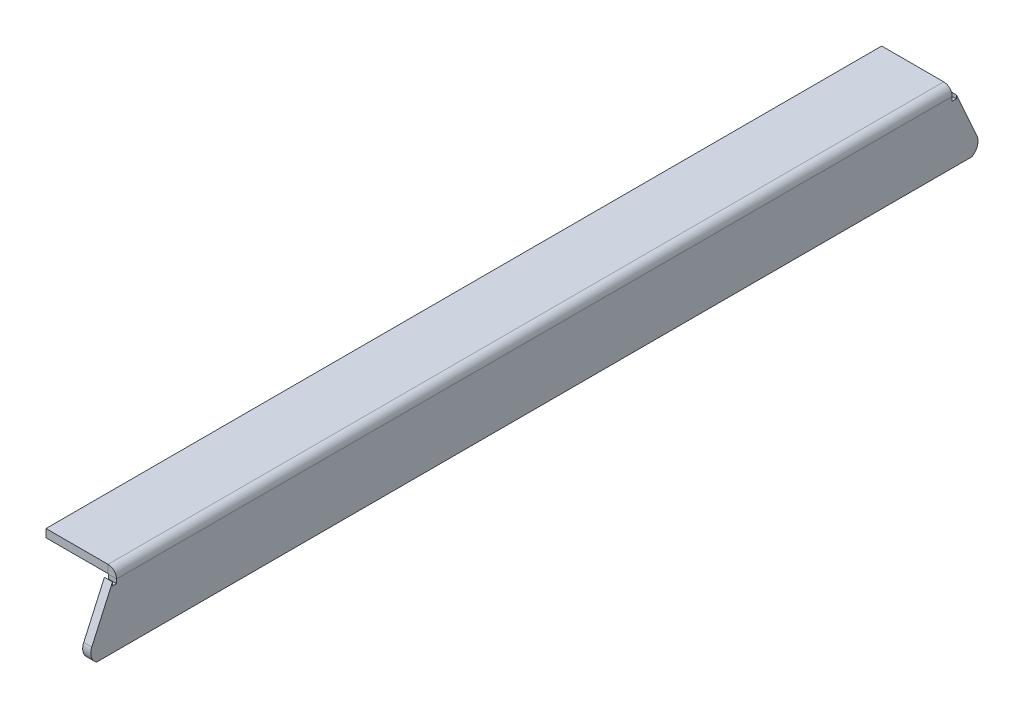
ISO-10303-21;
HEADER;
FILE_DESCRIPTION(('STEP AP214'),'2;1');
FILE_NAME('part.step','',(''),(''),'','','');
FILE_SCHEMA(('AUTOMOTIVE_DESIGN { 1 0 10303 214 1 1 1 1 }'));
ENDSEC;
DATA;
#1=APPLICATION_CONTEXT('core data for automotive mechanical design processes');
#2=APPLICATION_PROTOCOL_DEFINITION('international standard','automotive_design',2000,#1);
#3=PRODUCT_CONTEXT('',#1,'mechanical');
#4=PRODUCT('Part','Part','',(#3));
#5=PRODUCT_RELATED_PRODUCT_CATEGORY('part','',(#4));
#6=PRODUCT_DEFINITION_FORMATION('','',#4);
#7=PRODUCT_DEFINITION_CONTEXT('part definition',#1,'design');
#8=PRODUCT_DEFINITION('design','',#6,#7);
#9=PRODUCT_DEFINITION_SHAPE('','',#8);
#10=(LENGTH_UNIT() NAMED_UNIT(*) SI_UNIT(.MILLI.,.METRE.));
#11=(NAMED_UNIT(*) PLANE_ANGLE_UNIT() SI_UNIT($,.RADIAN.));
#12=(NAMED_UNIT(*) SI_UNIT($,.STERADIAN.) SOLID_ANGLE_UNIT());
#13=UNCERTAINTY_MEASURE_WITH_UNIT(LENGTH_MEASURE(1.E-05),#10,'distance_accuracy_value','');
#14=(GEOMETRIC_REPRESENTATION_CONTEXT(3) GLOBAL_UNCERTAINTY_ASSIGNED_CONTEXT((#13)) GLOBAL_UNIT_ASSIGNED_CONTEXT((#10,
#11,#12)) REPRESENTATION_CONTEXT('',''));
#15=CARTESIAN_POINT('',(0.,0.,0.));
#16=DIRECTION('',(0.,0.,1.));
#17=DIRECTION('',(1.,0.,0.));
#18=AXIS2_PLACEMENT_3D('',#15,#16,#17);
#19=CARTESIAN_POINT('',(-4.,20.5593429480245,-177.194547185028));
#20=DIRECTION('',(0.,0.,1.));
#21=DIRECTION('',(1.,0.,0.));
#22=AXIS2_PLACEMENT_3D('',#19,#20,#21);
#23=PLANE('',#22);
#24=DIRECTION('',(0.,-1.,0.));
#25=VECTOR('',#24,1.);
#26=CARTESIAN_POINT('',(0.,-4.76315361424819,-177.194547185028));
#27=LINE('',#26,#25);
#28=CARTESIAN_POINT('',(0.,20.5593429480245,-177.194547185028));
#29=VERTEX_POINT('',#28);
#30=CARTESIAN_POINT('',(0.,18.8106793541965,-177.194547185028));
#31=VERTEX_POINT('',#30);
#32=EDGE_CURVE('E13',#29,#31,#27,.T.);
#33=ORIENTED_EDGE('',*,*,#32,.F.);
#34=DIRECTION('',(1.,0.,0.));
#35=VECTOR('',#34,1.);
#36=CARTESIAN_POINT('',(-4.,20.5593429480245,-177.194547185028));
#37=LINE('',#36,#35);
#38=CARTESIAN_POINT('',(-4.,20.5593429480245,-177.194547185028));
#39=VERTEX_POINT('',#38);
#40=EDGE_CURVE('E251',#39,#29,#37,.T.);
#41=ORIENTED_EDGE('',*,*,#40,.F.);
#42=DIRECTION('',(0.,-1.,0.));
#43=VECTOR('',#42,1.);
#44=CARTESIAN_POINT('',(-4.,20.5593429480245,-177.194547185028));
#45=LINE('',#44,#43);
#46=CARTESIAN_POINT('',(-4.,18.8106793541965,-177.194547185028));
#47=VERTEX_POINT('',#46);
#48=EDGE_CURVE('E247',#39,#47,#45,.T.);
#49=ORIENTED_EDGE('',*,*,#48,.T.);
#50=DIRECTION('',(1.,0.,0.));
#51=VECTOR('',#50,1.);
#52=CARTESIAN_POINT('',(-4.,18.8106793541965,-177.194547185028));
#53=LINE('',#52,#51);
#54=EDGE_CURVE('E255',#47,#31,#53,.T.);
#55=ORIENTED_EDGE('',*,*,#54,.T.);
#56=EDGE_LOOP('',(#33,#41,#49,#55));
#57=FACE_BOUND('',#56,.T.);
#58=ADVANCED_FACE('F57',(#57),#23,.T.);
#59=CARTESIAN_POINT('',(-4.,18.8106793541965,-177.194547185028));
#60=DIRECTION('',(0.,1.,0.));
#61=DIRECTION('',(0.,0.,1.));
#62=AXIS2_PLACEMENT_3D('',#59,#60,#61);
#63=PLANE('',#62);
#64=DIRECTION('',(0.,0.,1.));
#65=VECTOR('',#64,1.);
#66=CARTESIAN_POINT('',(0.,18.8106793541965,246.371480001946));
#67=LINE('',#66,#65);
#68=CARTESIAN_POINT('',(0.,18.8106793541965,-175.194547185028));
#69=VERTEX_POINT('',#68);
#70=EDGE_CURVE('E65',#31,#69,#67,.T.);
#71=ORIENTED_EDGE('',*,*,#70,.F.);
#72=ORIENTED_EDGE('',*,*,#54,.F.);
#73=DIRECTION('',(0.,0.,1.));
#74=VECTOR('',#73,1.);
#75=CARTESIAN_POINT('',(-4.,18.8106793541965,-177.194547185028));
#76=LINE('',#75,#74);
#77=CARTESIAN_POINT('',(-4.,18.8106793541965,-175.194547185028));
#78=VERTEX_POINT('',#77);
#79=EDGE_CURVE('E252',#47,#78,#76,.T.);
#80=ORIENTED_EDGE('',*,*,#79,.T.);
#81=DIRECTION('',(1.,0.,0.));
#82=VECTOR('',#81,1.);
#83=CARTESIAN_POINT('',(-4.,18.8106793541965,-175.194547185028));
#84=LINE('',#83,#82);
#85=EDGE_CURVE('E259',#78,#69,#84,.T.);
#86=ORIENTED_EDGE('',*,*,#85,.T.);
#87=EDGE_LOOP('',(#71,#72,#80,#86));
#88=FACE_BOUND('',#87,.T.);
#89=ADVANCED_FACE('F325',(#88),#63,.T.);
#90=CARTESIAN_POINT('',(-4.,18.8106793541965,-175.194547185028));
#91=DIRECTION('',(0.,0.,-1.));
#92=DIRECTION('',(-1.,0.,0.));
#93=AXIS2_PLACEMENT_3D('',#90,#91,#92);
#94=PLANE('',#93);
#95=DIRECTION('',(0.,1.,0.));
#96=VECTOR('',#95,1.);
#97=CARTESIAN_POINT('',(0.,-4.76315361424819,-175.194547185028));
#98=LINE('',#97,#96);
#99=CARTESIAN_POINT('',(0.,20.8106793541965,-175.194547185028));
#100=VERTEX_POINT('',#99);
#101=EDGE_CURVE('E319',#69,#100,#98,.T.);
#102=ORIENTED_EDGE('',*,*,#101,.F.);
#103=ORIENTED_EDGE('',*,*,#85,.F.);
#104=DIRECTION('',(0.,1.,0.));
#105=VECTOR('',#104,1.);
#106=CARTESIAN_POINT('',(-4.,18.8106793541965,-175.194547185028));
#107=LINE('',#106,#105);
#108=CARTESIAN_POINT('',(-4.,20.8106793541965,-175.194547185028));
#109=VERTEX_POINT('',#108);
#110=EDGE_CURVE('E256',#78,#109,#107,.T.);
#111=ORIENTED_EDGE('',*,*,#110,.T.);
#112=DIRECTION('',(1.,0.,0.));
#113=VECTOR('',#112,1.);
#114=CARTESIAN_POINT('',(-4.,20.8106793541965,-175.194547185028));
#115=LINE('',#114,#113);
#116=EDGE_CURVE('E235',#109,#100,#115,.T.);
#117=ORIENTED_EDGE('',*,*,#116,.T.);
#118=EDGE_LOOP('',(#102,#103,#111,#117));
#119=FACE_BOUND('',#118,.T.);
#120=ADVANCED_FACE('F335',(#119),#94,.T.);
#121=CARTESIAN_POINT('',(-4.,20.8106793541965,239.571798792427));
#122=DIRECTION('',(0.,0.,1.));
#123=DIRECTION('',(1.,0.,0.));
#124=AXIS2_PLACEMENT_3D('',#121,#122,#123);
#125=PLANE('',#124);
#126=DIRECTION('',(0.,-1.,0.));
#127=VECTOR('',#126,1.);
#128=CARTESIAN_POINT('',(0.,-4.76315361424819,239.571798792427));
#129=LINE('',#128,#127);
#130=CARTESIAN_POINT('',(0.,20.8106793541965,239.571798792427));
#131=VERTEX_POINT('',#130);
#132=CARTESIAN_POINT('',(0.,18.8106793541965,239.571798792427));
#133=VERTEX_POINT('',#132);
#134=EDGE_CURVE('E316',#131,#133,#129,.T.);
#135=ORIENTED_EDGE('',*,*,#134,.F.);
#136=DIRECTION('',(1.,0.,0.));
#137=VECTOR('',#136,1.);
#138=CARTESIAN_POINT('',(-4.,20.8106793541965,239.571798792427));
#139=LINE('',#138,#137);
#140=CARTESIAN_POINT('',(-4.,20.8106793541965,239.571798792427));
#141=VERTEX_POINT('',#140);
#142=EDGE_CURVE('E242',#141,#131,#139,.T.);
#143=ORIENTED_EDGE('',*,*,#142,.F.);
#144=DIRECTION('',(0.,-1.,0.));
#145=VECTOR('',#144,1.);
#146=CARTESIAN_POINT('',(-4.,20.8106793541965,239.571798792427));
#147=LINE('',#146,#145);
#148=CARTESIAN_POINT('',(-4.,18.8106793541965,239.571798792427));
#149=VERTEX_POINT('',#148);
#150=EDGE_CURVE('E260',#141,#149,#147,.T.);
#151=ORIENTED_EDGE('',*,*,#150,.T.);
#152=DIRECTION('',(1.,0.,0.));
#153=VECTOR('',#152,1.);
#154=CARTESIAN_POINT('',(-4.,18.8106793541965,239.571798792427));
#155=LINE('',#154,#153);
#156=EDGE_CURVE('E266',#149,#133,#155,.T.);
#157=ORIENTED_EDGE('',*,*,#156,.T.);
#158=EDGE_LOOP('',(#135,#143,#151,#157));
#159=FACE_BOUND('',#158,.T.);
#160=ADVANCED_FACE('F399',(#159),#125,.T.);
#161=CARTESIAN_POINT('',(-4.,18.8106793541965,239.571798792427));
#162=DIRECTION('',(0.,1.,0.));
#163=DIRECTION('',(0.,0.,1.));
#164=AXIS2_PLACEMENT_3D('',#161,#162,#163);
#165=PLANE('',#164);
#166=DIRECTION('',(0.,0.,1.));
#167=VECTOR('',#166,1.);
#168=CARTESIAN_POINT('',(0.,18.8106793541965,246.371480001946));
#169=LINE('',#168,#167);
#170=CARTESIAN_POINT('',(0.,18.8106793541965,241.571798792427));
#171=VERTEX_POINT('',#170);
#172=EDGE_CURVE('E313',#133,#171,#169,.T.);
#173=ORIENTED_EDGE('',*,*,#172,.F.);
#174=ORIENTED_EDGE('',*,*,#156,.F.);
#175=DIRECTION('',(0.,0.,1.));
#176=VECTOR('',#175,1.);
#177=CARTESIAN_POINT('',(-4.,18.8106793541965,239.571798792427));
#178=LINE('',#177,#176);
#179=CARTESIAN_POINT('',(-4.,18.8106793541965,241.571798792427));
#180=VERTEX_POINT('',#179);
#181=EDGE_CURVE('E263',#149,#180,#178,.T.);
#182=ORIENTED_EDGE('',*,*,#181,.T.);
#183=DIRECTION('',(1.,0.,0.));
#184=VECTOR('',#183,1.);
#185=CARTESIAN_POINT('',(-4.,18.8106793541965,241.571798792427));
#186=LINE('',#185,#184);
#187=EDGE_CURVE('E245',#180,#171,#186,.T.);
#188=ORIENTED_EDGE('',*,*,#187,.T.);
#189=EDGE_LOOP('',(#173,#174,#182,#188));
#190=FACE_BOUND('',#189,.T.);
#191=ADVANCED_FACE('F389',(#190),#165,.T.);
#192=CARTESIAN_POINT('',(-4.,18.8106793541965,241.571798792427));
#193=DIRECTION('',(0.,0.,-1.));
#194=DIRECTION('',(-1.,0.,0.));
#195=AXIS2_PLACEMENT_3D('',#192,#193,#194);
#196=PLANE('',#195);
#197=DIRECTION('',(0.,1.,0.));
#198=VECTOR('',#197,1.);
#199=CARTESIAN_POINT('',(0.,-4.76315361424819,241.571798792427));
#200=LINE('',#199,#198);
#201=CARTESIAN_POINT('',(0.,20.5593429480245,241.571798792427));
#202=VERTEX_POINT('',#201);
#203=EDGE_CURVE('E306',#171,#202,#200,.T.);
#204=ORIENTED_EDGE('',*,*,#203,.F.);
#205=ORIENTED_EDGE('',*,*,#187,.F.);
#206=DIRECTION('',(0.,1.,0.));
#207=VECTOR('',#206,1.);
#208=CARTESIAN_POINT('',(-4.,18.8106793541965,241.571798792427));
#209=LINE('',#208,#207);
#210=CARTESIAN_POINT('',(-4.,20.5593429480245,241.571798792427));
#211=VERTEX_POINT('',#210);
#212=EDGE_CURVE('E267',#180,#211,#209,.T.);
#213=ORIENTED_EDGE('',*,*,#212,.T.);
#214=DIRECTION('',(1.,0.,0.));
#215=VECTOR('',#214,1.);
#216=CARTESIAN_POINT('',(-4.,20.5593429480245,241.571798792427));
#217=LINE('',#216,#215);
#218=EDGE_CURVE('E72',#211,#202,#217,.T.);
#219=ORIENTED_EDGE('',*,*,#218,.T.);
#220=EDGE_LOOP('',(#204,#205,#213,#219));
#221=FACE_BOUND('',#220,.T.);
#222=ADVANCED_FACE('F385',(#221),#196,.T.);
#223=CARTESIAN_POINT('',(-4.,-2.3041370040118,-187.46718347481));
#224=DIRECTION('',(0.,0.409836101706063,-0.91215918004391));
#225=DIRECTION('',(0.,0.91215918004391,0.409836101706063));
#226=AXIS2_PLACEMENT_3D('',#223,#224,#225);
#227=PLANE('',#226);
#228=DIRECTION('',(0.,0.91215918004391,0.409836101706063));
#229=VECTOR('',#228,1.);
#230=CARTESIAN_POINT('',(-4.,-2.3041370040118,-187.46718347481));
#231=LINE('',#230,#229);
#232=CARTESIAN_POINT('',(-4.,-2.30413700401181,-187.46718347481));
#233=VERTEX_POINT('',#232);
#234=EDGE_CURVE('E280',#233,#39,#231,.T.);
#235=ORIENTED_EDGE('',*,*,#234,.T.);
#236=ORIENTED_EDGE('',*,*,#40,.T.);
#237=DIRECTION('',(0.,0.91215918004391,0.409836101706063));
#238=VECTOR('',#237,1.);
#239=CARTESIAN_POINT('',(0.,-2.3041370040118,-187.46718347481));
#240=LINE('',#239,#238);
#241=CARTESIAN_POINT('',(0.,-2.30413700401181,-187.46718347481));
#242=VERTEX_POINT('',#241);
#243=EDGE_CURVE('E250',#242,#29,#240,.T.);
#244=ORIENTED_EDGE('',*,*,#243,.F.);
#245=DIRECTION('',(1.,0.,0.));
#246=VECTOR('',#245,1.);
#247=CARTESIAN_POINT('',(-4.,-2.30413700401181,-187.46718347481));
#248=LINE('',#247,#246);
#249=EDGE_CURVE('E81',#233,#242,#248,.T.);
#250=ORIENTED_EDGE('',*,*,#249,.F.);
#251=EDGE_LOOP('',(#235,#236,#244,#250));
#252=FACE_BOUND('',#251,.T.);
#253=ADVANCED_FACE('F59',(#252),#227,.T.);
#254=CARTESIAN_POINT('',(-4.,-2.30413700401182,251.844435082209));
#255=DIRECTION('',(0.,0.409836101706063,0.91215918004391));
#256=DIRECTION('',(0.,-0.91215918004391,0.409836101706063));
#257=AXIS2_PLACEMENT_3D('',#254,#255,#256);
#258=PLANE('',#257);
#259=DIRECTION('',(0.,-0.91215918004391,0.409836101706063));
#260=VECTOR('',#259,1.);
#261=CARTESIAN_POINT('',(0.,-2.30413700401182,251.844435082209));
#262=LINE('',#261,#260);
#263=CARTESIAN_POINT('',(0.,-2.30413700401182,251.844435082209));
#264=VERTEX_POINT('',#263);
#265=EDGE_CURVE('E295',#202,#264,#262,.T.);
#266=ORIENTED_EDGE('',*,*,#265,.F.);
#267=ORIENTED_EDGE('',*,*,#218,.F.);
#268=DIRECTION('',(0.,-0.91215918004391,0.409836101706063));
#269=VECTOR('',#268,1.);
#270=CARTESIAN_POINT('',(-4.,-2.30413700401182,251.844435082209));
#271=LINE('',#270,#269);
#272=CARTESIAN_POINT('',(-4.,-2.30413700401182,251.844435082209));
#273=VERTEX_POINT('',#272);
#274=EDGE_CURVE('E107',#211,#273,#271,.T.);
#275=ORIENTED_EDGE('',*,*,#274,.T.);
#276=DIRECTION('',(1.,0.,0.));
#277=VECTOR('',#276,1.);
#278=CARTESIAN_POINT('',(-4.,-2.30413700401182,251.844435082209));
#279=LINE('',#278,#277);
#280=EDGE_CURVE('E292',#273,#264,#279,.T.);
#281=ORIENTED_EDGE('',*,*,#280,.T.);
#282=EDGE_LOOP('',(#266,#267,#275,#281));
#283=FACE_BOUND('',#282,.T.);
#284=ADVANCED_FACE('F367',(#283),#258,.T.);
#285=CARTESIAN_POINT('',(-4.,-4.76315361424819,246.371480001946));
#286=DIRECTION('',(1.,0.,0.));
#287=DIRECTION('',(0.,0.,-1.));
#288=AXIS2_PLACEMENT_3D('',#285,#286,#287);
#289=PLANE('',#288);
#290=ORIENTED_EDGE('',*,*,#48,.F.);
#291=ORIENTED_EDGE('',*,*,#234,.F.);
#292=CARTESIAN_POINT('',(-4.,-4.76315361424819,-181.994228394547));
#293=DIRECTION('',(1.,0.,0.));
#294=DIRECTION('',(0.,0.,-1.));
#295=AXIS2_PLACEMENT_3D('',#292,#293,#294);
#296=CIRCLE('',#295,6.);
#297=CARTESIAN_POINT('',(-4.,-9.98932064580346,-184.941630328163));
#298=VERTEX_POINT('',#297);
#299=EDGE_CURVE('E290',#298,#233,#296,.T.);
#300=ORIENTED_EDGE('',*,*,#299,.F.);
#301=DIRECTION('',(0.,0.,-1.));
#302=VECTOR('',#301,1.);
#303=CARTESIAN_POINT('',(-4.,-9.98932064580346,-184.941630328163));
#304=LINE('',#303,#302);
#305=CARTESIAN_POINT('',(-4.,-9.98932064580347,249.318881935562));
#306=VERTEX_POINT('',#305);
#307=EDGE_CURVE('E287',#306,#298,#304,.T.);
#308=ORIENTED_EDGE('',*,*,#307,.F.);
#309=CARTESIAN_POINT('',(-4.,-4.76315361424819,246.371480001946));
#310=DIRECTION('',(1.,0.,0.));
#311=DIRECTION('',(0.,0.,-1.));
#312=AXIS2_PLACEMENT_3D('',#309,#310,#311);
#313=CIRCLE('',#312,5.99999999999999);
#314=EDGE_CURVE('E284',#273,#306,#313,.T.);
#315=ORIENTED_EDGE('',*,*,#314,.F.);
#316=ORIENTED_EDGE('',*,*,#274,.F.);
#317=ORIENTED_EDGE('',*,*,#212,.F.);
#318=ORIENTED_EDGE('',*,*,#181,.F.);
#319=ORIENTED_EDGE('',*,*,#150,.F.);
#320=DIRECTION('',(0.,0.,-1.));
#321=VECTOR('',#320,1.);
#322=CARTESIAN_POINT('',(-4.,20.8106793541965,-175.194547185028));
#323=LINE('',#322,#321);
#324=EDGE_CURVE('E239',#109,#141,#323,.F.);
#325=ORIENTED_EDGE('',*,*,#324,.F.);
#326=ORIENTED_EDGE('',*,*,#110,.F.);
#327=ORIENTED_EDGE('',*,*,#79,.F.);
#328=EDGE_LOOP('',(#290,#291,#300,#308,#315,#316,#317,#318,#319,#325,#326,#327));
#329=FACE_BOUND('',#328,.T.);
#330=ADVANCED_FACE('F331',(#329),#289,.F.);
#331=CARTESIAN_POINT('',(0.,-4.76315361424819,246.371480001946));
#332=DIRECTION('',(1.,0.,0.));
#333=DIRECTION('',(0.,0.,-1.));
#334=AXIS2_PLACEMENT_3D('',#331,#332,#333);
#335=PLANE('',#334);
#336=ORIENTED_EDGE('',*,*,#243,.T.);
#337=ORIENTED_EDGE('',*,*,#32,.T.);
#338=ORIENTED_EDGE('',*,*,#70,.T.);
#339=ORIENTED_EDGE('',*,*,#101,.T.);
#340=DIRECTION('',(0.,0.,-1.));
#341=VECTOR('',#340,1.);
#342=CARTESIAN_POINT('',(0.,20.8106793541965,-175.194547185028));
#343=LINE('',#342,#341);
#344=EDGE_CURVE('E185',#100,#131,#343,.F.);
#345=ORIENTED_EDGE('',*,*,#344,.T.);
#346=ORIENTED_EDGE('',*,*,#134,.T.);
#347=ORIENTED_EDGE('',*,*,#172,.T.);
#348=ORIENTED_EDGE('',*,*,#203,.T.);
#349=ORIENTED_EDGE('',*,*,#265,.T.);
#350=CARTESIAN_POINT('',(0.,-4.76315361424819,246.371480001946));
#351=DIRECTION('',(1.,0.,0.));
#352=DIRECTION('',(0.,0.,-1.));
#353=AXIS2_PLACEMENT_3D('',#350,#351,#352);
#354=CIRCLE('',#353,5.99999999999999);
#355=CARTESIAN_POINT('',(0.,-9.98932064580347,249.318881935562));
#356=VERTEX_POINT('',#355);
#357=EDGE_CURVE('E297',#264,#356,#354,.T.);
#358=ORIENTED_EDGE('',*,*,#357,.T.);
#359=DIRECTION('',(0.,0.,-1.));
#360=VECTOR('',#359,1.);
#361=CARTESIAN_POINT('',(0.,-9.98932064580346,-184.941630328163));
#362=LINE('',#361,#360);
#363=CARTESIAN_POINT('',(0.,-9.98932064580346,-184.941630328163));
#364=VERTEX_POINT('',#363);
#365=EDGE_CURVE('E300',#356,#364,#362,.T.);
#366=ORIENTED_EDGE('',*,*,#365,.T.);
#367=CARTESIAN_POINT('',(0.,-4.76315361424819,-181.994228394547));
#368=DIRECTION('',(1.,0.,0.));
#369=DIRECTION('',(0.,0.,-1.));
#370=AXIS2_PLACEMENT_3D('',#367,#368,#369);
#371=CIRCLE('',#370,6.);
#372=EDGE_CURVE('E282',#364,#242,#371,.T.);
#373=ORIENTED_EDGE('',*,*,#372,.T.);
#374=EDGE_LOOP('',(#336,#337,#338,#339,#345,#346,#347,#348,#349,#358,#366,#373));
#375=FACE_BOUND('',#374,.T.);
#376=ADVANCED_FACE('F323',(#375),#335,.T.);
#377=CARTESIAN_POINT('',(-4.,-4.76315361424819,-181.994228394547));
#378=DIRECTION('',(1.,0.,0.));
#379=DIRECTION('',(0.,0.,-1.));
#380=AXIS2_PLACEMENT_3D('',#377,#378,#379);
#381=CYLINDRICAL_SURFACE('',#380,6.);
#382=ORIENTED_EDGE('',*,*,#372,.F.);
#383=DIRECTION('',(1.,0.,0.));
#384=VECTOR('',#383,1.);
#385=CARTESIAN_POINT('',(-4.,-9.98932064580346,-184.941630328163));
#386=LINE('',#385,#384);
#387=EDGE_CURVE('E307',#298,#364,#386,.T.);
#388=ORIENTED_EDGE('',*,*,#387,.F.);
#389=ORIENTED_EDGE('',*,*,#299,.T.);
#390=ORIENTED_EDGE('',*,*,#249,.T.);
#391=EDGE_LOOP('',(#382,#388,#389,#390));
#392=FACE_BOUND('',#391,.T.);
#393=ADVANCED_FACE('F370',(#392),#381,.T.);
#394=CARTESIAN_POINT('',(-4.,-9.98932064580346,-184.941630328163));
#395=DIRECTION('',(0.,-1.,0.));
#396=DIRECTION('',(0.,0.,-1.));
#397=AXIS2_PLACEMENT_3D('',#394,#395,#396);
#398=PLANE('',#397);
#399=ORIENTED_EDGE('',*,*,#365,.F.);
#400=DIRECTION('',(1.,0.,0.));
#401=VECTOR('',#400,1.);
#402=CARTESIAN_POINT('',(-4.,-9.98932064580347,249.318881935562));
#403=LINE('',#402,#401);
#404=EDGE_CURVE('E309',#306,#356,#403,.T.);
#405=ORIENTED_EDGE('',*,*,#404,.F.);
#406=ORIENTED_EDGE('',*,*,#307,.T.);
#407=ORIENTED_EDGE('',*,*,#387,.T.);
#408=EDGE_LOOP('',(#399,#405,#406,#407));
#409=FACE_BOUND('',#408,.T.);
#410=ADVANCED_FACE('F373',(#409),#398,.T.);
#411=CARTESIAN_POINT('',(-4.,-4.76315361424819,246.371480001946));
#412=DIRECTION('',(1.,0.,0.));
#413=DIRECTION('',(0.,0.,-1.));
#414=AXIS2_PLACEMENT_3D('',#411,#412,#413);
#415=CYLINDRICAL_SURFACE('',#414,5.99999999999999);
#416=ORIENTED_EDGE('',*,*,#357,.F.);
#417=ORIENTED_EDGE('',*,*,#280,.F.);
#418=ORIENTED_EDGE('',*,*,#314,.T.);
#419=ORIENTED_EDGE('',*,*,#404,.T.);
#420=EDGE_LOOP('',(#416,#417,#418,#419));
#421=FACE_BOUND('',#420,.T.);
#422=ADVANCED_FACE('F376',(#421),#415,.T.);
#423=CARTESIAN_POINT('',(-4.2,20.8106793541965,239.571798792427));
#424=DIRECTION('',(0.,0.,1.));
#425=DIRECTION('',(1.,0.,0.));
#426=AXIS2_PLACEMENT_3D('',#423,#424,#425);
#427=PLANE('',#426);
#428=DIRECTION('',(0.,1.,0.));
#429=VECTOR('',#428,1.);
#430=CARTESIAN_POINT('',(-4.19999999999999,25.0106793541965,239.571798792427));
#431=LINE('',#430,#429);
#432=CARTESIAN_POINT('',(-4.2,21.0106793541965,239.571798792427));
#433=VERTEX_POINT('',#432);
#434=CARTESIAN_POINT('',(-4.19999999999998,25.0106793541965,239.571798792427));
#435=VERTEX_POINT('',#434);
#436=EDGE_CURVE('E230',#433,#435,#431,.T.);
#437=ORIENTED_EDGE('',*,*,#436,.F.);
#438=CARTESIAN_POINT('',(-4.2,20.8106793541965,239.571798792427));
#439=DIRECTION('',(0.,0.,-1.));
#440=DIRECTION('',(-1.,0.,0.));
#441=AXIS2_PLACEMENT_3D('',#438,#439,#440);
#442=CIRCLE('',#441,0.199999999999999);
#443=EDGE_CURVE('E188',#141,#433,#442,.F.);
#444=ORIENTED_EDGE('',*,*,#443,.F.);
#445=ORIENTED_EDGE('',*,*,#142,.T.);
#446=CARTESIAN_POINT('',(-4.2,20.8106793541965,239.571798792427));
#447=DIRECTION('',(0.,0.,-1.));
#448=DIRECTION('',(-1.,0.,0.));
#449=AXIS2_PLACEMENT_3D('',#446,#447,#448);
#450=CIRCLE('',#449,4.2);
#451=EDGE_CURVE('E234',#131,#435,#450,.F.);
#452=ORIENTED_EDGE('',*,*,#451,.T.);
#453=EDGE_LOOP('',(#437,#444,#445,#452));
#454=FACE_BOUND('',#453,.T.);
#455=ADVANCED_FACE('F379',(#454),#427,.T.);
#456=CARTESIAN_POINT('',(-4.2,20.8106793541965,-175.194547185028));
#457=DIRECTION('',(0.,0.,1.));
#458=DIRECTION('',(1.,0.,0.));
#459=AXIS2_PLACEMENT_3D('',#456,#457,#458);
#460=PLANE('',#459);
#461=CARTESIAN_POINT('',(-4.2,20.8106793541965,-175.194547185028));
#462=DIRECTION('',(0.,0.,-1.));
#463=DIRECTION('',(-1.,0.,0.));
#464=AXIS2_PLACEMENT_3D('',#461,#462,#463);
#465=CIRCLE('',#464,0.199999999999999);
#466=CARTESIAN_POINT('',(-4.2,21.0106793541965,-175.194547185028));
#467=VERTEX_POINT('',#466);
#468=EDGE_CURVE('E195',#467,#109,#465,.T.);
#469=ORIENTED_EDGE('',*,*,#468,.F.);
#470=DIRECTION('',(0.,1.,0.));
#471=VECTOR('',#470,1.);
#472=CARTESIAN_POINT('',(-4.2,21.0106793541965,-175.194547185028));
#473=LINE('',#472,#471);
#474=CARTESIAN_POINT('',(-4.19999999999999,25.0106793541965,-175.194547185028));
#475=VERTEX_POINT('',#474);
#476=EDGE_CURVE('E192',#467,#475,#473,.T.);
#477=ORIENTED_EDGE('',*,*,#476,.T.);
#478=CARTESIAN_POINT('',(-4.2,20.8106793541965,-175.194547185028));
#479=DIRECTION('',(0.,0.,-1.));
#480=DIRECTION('',(-1.,0.,0.));
#481=AXIS2_PLACEMENT_3D('',#478,#479,#480);
#482=CIRCLE('',#481,4.2);
#483=EDGE_CURVE('E178',#475,#100,#482,.T.);
#484=ORIENTED_EDGE('',*,*,#483,.T.);
#485=ORIENTED_EDGE('',*,*,#116,.F.);
#486=EDGE_LOOP('',(#469,#477,#484,#485));
#487=FACE_BOUND('',#486,.T.);
#488=ADVANCED_FACE('F193',(#487),#460,.F.);
#489=CARTESIAN_POINT('',(-4.2,20.8106793541965,-175.194547185028));
#490=DIRECTION('',(0.,0.,-1.));
#491=DIRECTION('',(0.,1.,0.));
#492=AXIS2_PLACEMENT_3D('',#489,#490,#491);
#493=CYLINDRICAL_SURFACE('',#492,4.2);
#494=ORIENTED_EDGE('',*,*,#344,.F.);
#495=ORIENTED_EDGE('',*,*,#483,.F.);
#496=DIRECTION('',(0.,0.,-1.));
#497=VECTOR('',#496,1.);
#498=CARTESIAN_POINT('',(-4.19999999999999,25.0106793541965,0.));
#499=LINE('',#498,#497);
#500=EDGE_CURVE('E182',#435,#475,#499,.T.);
#501=ORIENTED_EDGE('',*,*,#500,.F.);
#502=ORIENTED_EDGE('',*,*,#451,.F.);
#503=EDGE_LOOP('',(#494,#495,#501,#502));
#504=FACE_BOUND('',#503,.T.);
#505=ADVANCED_FACE('F180',(#504),#493,.T.);
#506=CARTESIAN_POINT('',(-4.2,20.8106793541965,-175.194547185028));
#507=DIRECTION('',(0.,0.,-1.));
#508=DIRECTION('',(0.,1.,0.));
#509=AXIS2_PLACEMENT_3D('',#506,#507,#508);
#510=CYLINDRICAL_SURFACE('',#509,0.199999999999999);
#511=ORIENTED_EDGE('',*,*,#324,.T.);
#512=ORIENTED_EDGE('',*,*,#443,.T.);
#513=DIRECTION('',(0.,0.,1.));
#514=VECTOR('',#513,1.);
#515=CARTESIAN_POINT('',(-4.2,21.0106793541965,239.571798792427));
#516=LINE('',#515,#514);
#517=EDGE_CURVE('E200',#433,#467,#516,.F.);
#518=ORIENTED_EDGE('',*,*,#517,.T.);
#519=ORIENTED_EDGE('',*,*,#468,.T.);
#520=EDGE_LOOP('',(#511,#512,#518,#519));
#521=FACE_BOUND('',#520,.T.);
#522=ADVANCED_FACE('F337',(#521),#510,.F.);
#523=CARTESIAN_POINT('',(-3.99999999999999,25.0106793541965,-175.194547185028));
#524=DIRECTION('',(0.,0.,-1.));
#525=DIRECTION('',(-1.,0.,0.));
#526=AXIS2_PLACEMENT_3D('',#523,#524,#525);
#527=PLANE('',#526);
#528=DIRECTION('',(1.,0.,0.));
#529=VECTOR('',#528,1.);
#530=CARTESIAN_POINT('',(-3.99999999999999,25.0106793541965,-175.194547185028));
#531=LINE('',#530,#529);
#532=CARTESIAN_POINT('',(-35.,25.0106793541967,-175.194547185028));
#533=VERTEX_POINT('',#532);
#534=EDGE_CURVE('E207',#533,#475,#531,.T.);
#535=ORIENTED_EDGE('',*,*,#534,.T.);
#536=ORIENTED_EDGE('',*,*,#476,.F.);
#537=DIRECTION('',(-1.,0.,0.));
#538=VECTOR('',#537,1.);
#539=CARTESIAN_POINT('',(-3.83803436216671E-13,21.0106793541965,-175.194547185028));
#540=LINE('',#539,#538);
#541=CARTESIAN_POINT('',(-35.,21.0106793541966,-175.194547185028));
#542=VERTEX_POINT('',#541);
#543=EDGE_CURVE('E223',#542,#467,#540,.F.);
#544=ORIENTED_EDGE('',*,*,#543,.F.);
#545=DIRECTION('',(0.,-1.,0.));
#546=VECTOR('',#545,1.);
#547=CARTESIAN_POINT('',(-35.,25.0106793541967,-175.194547185028));
#548=LINE('',#547,#546);
#549=EDGE_CURVE('E212',#533,#542,#548,.T.);
#550=ORIENTED_EDGE('',*,*,#549,.F.);
#551=EDGE_LOOP('',(#535,#536,#544,#550));
#552=FACE_BOUND('',#551,.T.);
#553=ADVANCED_FACE('F211',(#552),#527,.T.);
#554=CARTESIAN_POINT('',(-35.,25.0106793541967,239.571798792427));
#555=DIRECTION('',(0.,0.,1.));
#556=DIRECTION('',(1.,0.,0.));
#557=AXIS2_PLACEMENT_3D('',#554,#555,#556);
#558=PLANE('',#557);
#559=DIRECTION('',(1.,0.,0.));
#560=VECTOR('',#559,1.);
#561=CARTESIAN_POINT('',(3.01271714824462E-13,21.0106793541965,239.571798792427));
#562=LINE('',#561,#560);
#563=CARTESIAN_POINT('',(-35.,21.0106793541966,239.571798792427));
#564=VERTEX_POINT('',#563);
#565=EDGE_CURVE('E209',#433,#564,#562,.F.);
#566=ORIENTED_EDGE('',*,*,#565,.F.);
#567=ORIENTED_EDGE('',*,*,#436,.T.);
#568=DIRECTION('',(-1.,0.,0.));
#569=VECTOR('',#568,1.);
#570=CARTESIAN_POINT('',(-35.,25.0106793541967,239.571798792427));
#571=LINE('',#570,#569);
#572=CARTESIAN_POINT('',(-35.,25.0106793541967,239.571798792427));
#573=VERTEX_POINT('',#572);
#574=EDGE_CURVE('E208',#435,#573,#571,.T.);
#575=ORIENTED_EDGE('',*,*,#574,.T.);
#576=DIRECTION('',(0.,-1.,0.));
#577=VECTOR('',#576,1.);
#578=CARTESIAN_POINT('',(-35.,25.0106793541967,239.571798792427));
#579=LINE('',#578,#577);
#580=EDGE_CURVE('E214',#573,#564,#579,.T.);
#581=ORIENTED_EDGE('',*,*,#580,.T.);
#582=EDGE_LOOP('',(#566,#567,#575,#581));
#583=FACE_BOUND('',#582,.T.);
#584=ADVANCED_FACE('F344',(#583),#558,.T.);
#585=CARTESIAN_POINT('',(1.00739150607079E-13,25.0106793541965,0.));
#586=DIRECTION('',(0.,1.,0.));
#587=DIRECTION('',(-1.,0.,0.));
#588=AXIS2_PLACEMENT_3D('',#585,#586,#587);
#589=PLANE('',#588);
#590=ORIENTED_EDGE('',*,*,#574,.F.);
#591=ORIENTED_EDGE('',*,*,#500,.T.);
#592=ORIENTED_EDGE('',*,*,#534,.F.);
#593=DIRECTION('',(0.,0.,-1.));
#594=VECTOR('',#593,1.);
#595=CARTESIAN_POINT('',(-35.,25.0106793541967,-175.194547185028));
#596=LINE('',#595,#594);
#597=EDGE_CURVE('E215',#573,#533,#596,.T.);
#598=ORIENTED_EDGE('',*,*,#597,.F.);
#599=EDGE_LOOP('',(#590,#591,#592,#598));
#600=FACE_BOUND('',#599,.T.);
#601=ADVANCED_FACE('F205',(#600),#589,.T.);
#602=CARTESIAN_POINT('',(0.,21.0106793541965,0.));
#603=DIRECTION('',(0.,1.,0.));
#604=DIRECTION('',(-1.,0.,0.));
#605=AXIS2_PLACEMENT_3D('',#602,#603,#604);
#606=PLANE('',#605);
#607=ORIENTED_EDGE('',*,*,#517,.F.);
#608=ORIENTED_EDGE('',*,*,#565,.T.);
#609=DIRECTION('',(0.,0.,1.));
#610=VECTOR('',#609,1.);
#611=CARTESIAN_POINT('',(-35.,21.0106793541966,0.));
#612=LINE('',#611,#610);
#613=EDGE_CURVE('E225',#564,#542,#612,.F.);
#614=ORIENTED_EDGE('',*,*,#613,.T.);
#615=ORIENTED_EDGE('',*,*,#543,.T.);
#616=EDGE_LOOP('',(#607,#608,#614,#615));
#617=FACE_BOUND('',#616,.T.);
#618=ADVANCED_FACE('F342',(#617),#606,.F.);
#619=CARTESIAN_POINT('',(-35.,25.0106793541967,-175.194547185028));
#620=DIRECTION('',(-1.,0.,0.));
#621=DIRECTION('',(0.,-1.,0.));
#622=AXIS2_PLACEMENT_3D('',#619,#620,#621);
#623=PLANE('',#622);
#624=ORIENTED_EDGE('',*,*,#613,.F.);
#625=ORIENTED_EDGE('',*,*,#580,.F.);
#626=ORIENTED_EDGE('',*,*,#597,.T.);
#627=ORIENTED_EDGE('',*,*,#549,.T.);
#628=EDGE_LOOP('',(#624,#625,#626,#627));
#629=FACE_BOUND('',#628,.T.);
#630=ADVANCED_FACE('F348',(#629),#623,.T.);
#631=CLOSED_SHELL('',(#58,#89,#120,#160,#191,#222,#253,#284,#330,#376,#393,#410,#422,#455,#488,
#505,#522,#553,#584,#601,#618,#630));
#632=MANIFOLD_SOLID_BREP('B2',#631);
#633=ADVANCED_BREP_SHAPE_REPRESENTATION('',(#18,#632),#14);
#634=SHAPE_DEFINITION_REPRESENTATION(#9,#633);
ENDSEC;
END-ISO-10303-21;
